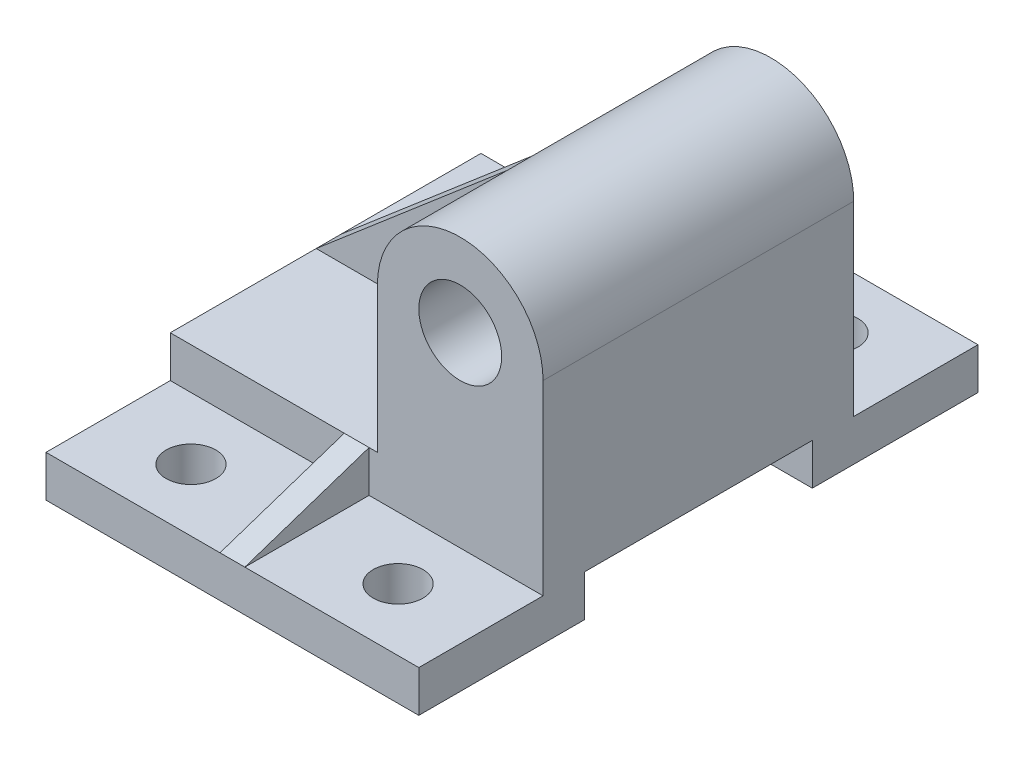
ISO-10303-21;
HEADER;
FILE_DESCRIPTION(('STEP AP214'),'2;1');
FILE_NAME('part.step','',(''),(''),'','','');
FILE_SCHEMA(('AUTOMOTIVE_DESIGN { 1 0 10303 214 1 1 1 1 }'));
ENDSEC;
DATA;
#1=APPLICATION_CONTEXT('core data for automotive mechanical design processes');
#2=APPLICATION_PROTOCOL_DEFINITION('international standard','automotive_design',2000,#1);
#3=PRODUCT_CONTEXT('',#1,'mechanical');
#4=PRODUCT('Part','Part','',(#3));
#5=PRODUCT_RELATED_PRODUCT_CATEGORY('part','',(#4));
#6=PRODUCT_DEFINITION_FORMATION('','',#4);
#7=PRODUCT_DEFINITION_CONTEXT('part definition',#1,'design');
#8=PRODUCT_DEFINITION('design','',#6,#7);
#9=PRODUCT_DEFINITION_SHAPE('','',#8);
#10=(LENGTH_UNIT() NAMED_UNIT(*) SI_UNIT(.MILLI.,.METRE.));
#11=(NAMED_UNIT(*) PLANE_ANGLE_UNIT() SI_UNIT($,.RADIAN.));
#12=(NAMED_UNIT(*) SI_UNIT($,.STERADIAN.) SOLID_ANGLE_UNIT());
#13=UNCERTAINTY_MEASURE_WITH_UNIT(LENGTH_MEASURE(1.E-05),#10,'distance_accuracy_value','');
#14=(GEOMETRIC_REPRESENTATION_CONTEXT(3) GLOBAL_UNCERTAINTY_ASSIGNED_CONTEXT((#13)) GLOBAL_UNIT_ASSIGNED_CONTEXT((#10,
#11,#12)) REPRESENTATION_CONTEXT('',''));
#15=CARTESIAN_POINT('',(0.,0.,0.));
#16=DIRECTION('',(0.,0.,1.));
#17=DIRECTION('',(1.,0.,0.));
#18=AXIS2_PLACEMENT_3D('',#15,#16,#17);
#19=CARTESIAN_POINT('',(-22.5,-17.5,135.));
#20=DIRECTION('',(1.,0.,0.));
#21=DIRECTION('',(0.,1.,0.));
#22=AXIS2_PLACEMENT_3D('',#19,#20,#21);
#23=PLANE('',#22);
#24=DIRECTION('',(0.,0.,-1.));
#25=VECTOR('',#24,1.);
#26=CARTESIAN_POINT('',(-22.5,-17.5,135.));
#27=LINE('',#26,#25);
#28=CARTESIAN_POINT('',(-22.5,-17.5,69.7772488596585));
#29=VERTEX_POINT('',#28);
#30=CARTESIAN_POINT('',(-22.5,-17.5,63.7772488596585));
#31=VERTEX_POINT('',#30);
#32=EDGE_CURVE('E199',#29,#31,#27,.T.);
#33=ORIENTED_EDGE('',*,*,#32,.T.);
#34=DIRECTION('',(0.,0.,-1.));
#35=VECTOR('',#34,1.);
#36=CARTESIAN_POINT('',(-22.5,-17.5,135.));
#37=LINE('',#36,#35);
#38=CARTESIAN_POINT('',(-22.5,-17.5,30.));
#39=VERTEX_POINT('',#38);
#40=EDGE_CURVE('E233',#31,#39,#37,.T.);
#41=ORIENTED_EDGE('',*,*,#40,.T.);
#42=DIRECTION('',(0.,1.,0.));
#43=VECTOR('',#42,1.);
#44=CARTESIAN_POINT('',(-22.5,-27.5,30.));
#45=LINE('',#44,#43);
#46=CARTESIAN_POINT('',(-22.5,-27.5,30.));
#47=VERTEX_POINT('',#46);
#48=EDGE_CURVE('E291',#47,#39,#45,.T.);
#49=ORIENTED_EDGE('',*,*,#48,.F.);
#50=DIRECTION('',(0.,0.,-1.));
#51=VECTOR('',#50,1.);
#52=CARTESIAN_POINT('',(-22.5,-27.5,30.));
#53=LINE('',#52,#51);
#54=CARTESIAN_POINT('',(-22.5,-27.5,0.));
#55=VERTEX_POINT('',#54);
#56=EDGE_CURVE('E308',#47,#55,#53,.T.);
#57=ORIENTED_EDGE('',*,*,#56,.T.);
#58=DIRECTION('',(0.,-1.,0.));
#59=VECTOR('',#58,1.);
#60=CARTESIAN_POINT('',(-22.5,-17.5,0.));
#61=LINE('',#60,#59);
#62=CARTESIAN_POINT('',(-22.5,-37.5,0.));
#63=VERTEX_POINT('',#62);
#64=EDGE_CURVE('E326',#55,#63,#61,.T.);
#65=ORIENTED_EDGE('',*,*,#64,.T.);
#66=DIRECTION('',(0.,0.,-1.));
#67=VECTOR('',#66,1.);
#68=CARTESIAN_POINT('',(-22.5,-37.5,135.));
#69=LINE('',#68,#67);
#70=CARTESIAN_POINT('',(-22.5,-37.5,40.));
#71=VERTEX_POINT('',#70);
#72=EDGE_CURVE('E252',#71,#63,#69,.T.);
#73=ORIENTED_EDGE('',*,*,#72,.F.);
#74=DIRECTION('',(0.,-1.,0.));
#75=VECTOR('',#74,1.);
#76=CARTESIAN_POINT('',(-22.5,-47.5,40.));
#77=LINE('',#76,#75);
#78=CARTESIAN_POINT('',(-22.5,-27.5,40.));
#79=VERTEX_POINT('',#78);
#80=EDGE_CURVE('E411',#79,#71,#77,.T.);
#81=ORIENTED_EDGE('',*,*,#80,.F.);
#82=DIRECTION('',(0.,0.,-1.));
#83=VECTOR('',#82,1.);
#84=CARTESIAN_POINT('',(-22.5,-27.5,40.));
#85=LINE('',#84,#83);
#86=CARTESIAN_POINT('',(-22.5,-27.5,95.));
#87=VERTEX_POINT('',#86);
#88=EDGE_CURVE('E418',#87,#79,#85,.T.);
#89=ORIENTED_EDGE('',*,*,#88,.F.);
#90=DIRECTION('',(0.,1.,0.));
#91=VECTOR('',#90,1.);
#92=CARTESIAN_POINT('',(-22.5,-47.5,95.));
#93=LINE('',#92,#91);
#94=CARTESIAN_POINT('',(-22.5,-37.5,95.));
#95=VERTEX_POINT('',#94);
#96=EDGE_CURVE('E398',#95,#87,#93,.T.);
#97=ORIENTED_EDGE('',*,*,#96,.F.);
#98=CARTESIAN_POINT('',(-22.5,-37.5,135.));
#99=VERTEX_POINT('',#98);
#100=EDGE_CURVE('E253',#99,#95,#69,.T.);
#101=ORIENTED_EDGE('',*,*,#100,.F.);
#102=DIRECTION('',(0.,-1.,0.));
#103=VECTOR('',#102,1.);
#104=CARTESIAN_POINT('',(-22.5,-17.5,135.));
#105=LINE('',#104,#103);
#106=CARTESIAN_POINT('',(-22.5,-27.5,135.));
#107=VERTEX_POINT('',#106);
#108=EDGE_CURVE('E328',#107,#99,#105,.T.);
#109=ORIENTED_EDGE('',*,*,#108,.F.);
#110=DIRECTION('',(0.,0.,1.));
#111=VECTOR('',#110,1.);
#112=CARTESIAN_POINT('',(-22.5,-27.5,105.));
#113=LINE('',#112,#111);
#114=CARTESIAN_POINT('',(-22.5,-27.5,105.));
#115=VERTEX_POINT('',#114);
#116=EDGE_CURVE('E320',#115,#107,#113,.T.);
#117=ORIENTED_EDGE('',*,*,#116,.F.);
#118=DIRECTION('',(0.,-1.,0.));
#119=VECTOR('',#118,1.);
#120=CARTESIAN_POINT('',(-22.5,0.,105.));
#121=LINE('',#120,#119);
#122=CARTESIAN_POINT('',(-22.5,-17.5,105.));
#123=VERTEX_POINT('',#122);
#124=EDGE_CURVE('E231',#123,#115,#121,.T.);
#125=ORIENTED_EDGE('',*,*,#124,.F.);
#126=EDGE_CURVE('E223',#123,#29,#37,.T.);
#127=ORIENTED_EDGE('',*,*,#126,.T.);
#128=EDGE_LOOP('',(#33,#41,#49,#57,#65,#73,#81,#89,#97,#101,#109,#117,#125,#127));
#129=FACE_BOUND('',#128,.T.);
#130=ADVANCED_FACE('F37',(#129),#23,.F.);
#131=CARTESIAN_POINT('',(37.5,27.5,69.7772488596585));
#132=DIRECTION('',(0.,0.,1.));
#133=DIRECTION('',(1.,0.,0.));
#134=AXIS2_PLACEMENT_3D('',#131,#132,#133);
#135=PLANE('',#134);
#136=CARTESIAN_POINT('',(47.5,17.5,69.7772488596585));
#137=DIRECTION('',(0.,0.,1.));
#138=DIRECTION('',(1.,0.,0.));
#139=AXIS2_PLACEMENT_3D('',#136,#137,#138);
#140=CIRCLE('',#139,20.);
#141=CARTESIAN_POINT('',(30.1794919243112,27.5,69.7772488596585));
#142=VERTEX_POINT('',#141);
#143=CARTESIAN_POINT('',(27.5,17.5,69.7772488596585));
#144=VERTEX_POINT('',#143);
#145=EDGE_CURVE('E214',#142,#144,#140,.T.);
#146=ORIENTED_EDGE('',*,*,#145,.F.);
#147=DIRECTION('',(-0.760352764253766,-0.649510333937542,0.));
#148=VECTOR('',#147,1.);
#149=CARTESIAN_POINT('',(34.4117435684364,31.1152839943724,69.7772488596585));
#150=LINE('',#149,#148);
#151=EDGE_CURVE('E202',#142,#29,#150,.T.);
#152=ORIENTED_EDGE('',*,*,#151,.T.);
#153=DIRECTION('',(-1.,0.,0.));
#154=VECTOR('',#153,1.);
#155=CARTESIAN_POINT('',(37.5,-17.5,69.7772488596585));
#156=LINE('',#155,#154);
#157=CARTESIAN_POINT('',(27.5,-17.5,69.7772488596585));
#158=VERTEX_POINT('',#157);
#159=EDGE_CURVE('E211',#158,#29,#156,.T.);
#160=ORIENTED_EDGE('',*,*,#159,.F.);
#161=DIRECTION('',(0.,-1.,0.));
#162=VECTOR('',#161,1.);
#163=CARTESIAN_POINT('',(27.5,17.5,69.7772488596585));
#164=LINE('',#163,#162);
#165=EDGE_CURVE('E453',#144,#158,#164,.T.);
#166=ORIENTED_EDGE('',*,*,#165,.F.);
#167=EDGE_LOOP('',(#146,#152,#160,#166));
#168=FACE_BOUND('',#167,.T.);
#169=ADVANCED_FACE('F210',(#168),#135,.T.);
#170=CARTESIAN_POINT('',(37.5,27.5,63.7772488596585));
#171=DIRECTION('',(0.,0.,-1.));
#172=DIRECTION('',(-1.,0.,0.));
#173=AXIS2_PLACEMENT_3D('',#170,#171,#172);
#174=PLANE('',#173);
#175=DIRECTION('',(-1.,0.,0.));
#176=VECTOR('',#175,1.);
#177=CARTESIAN_POINT('',(37.5,-17.5,63.7772488596585));
#178=LINE('',#177,#176);
#179=CARTESIAN_POINT('',(27.5,-17.5,63.7772488596585));
#180=VERTEX_POINT('',#179);
#181=EDGE_CURVE('E216',#180,#31,#178,.T.);
#182=ORIENTED_EDGE('',*,*,#181,.T.);
#183=DIRECTION('',(0.760352764253766,0.649510333937542,0.));
#184=VECTOR('',#183,1.);
#185=CARTESIAN_POINT('',(34.4117435684364,31.1152839943724,63.7772488596585));
#186=LINE('',#185,#184);
#187=CARTESIAN_POINT('',(30.1794919243112,27.5,63.7772488596585));
#188=VERTEX_POINT('',#187);
#189=EDGE_CURVE('E11',#31,#188,#186,.T.);
#190=ORIENTED_EDGE('',*,*,#189,.T.);
#191=CARTESIAN_POINT('',(47.5,17.5,63.7772488596585));
#192=DIRECTION('',(0.,0.,-1.));
#193=DIRECTION('',(-1.,0.,0.));
#194=AXIS2_PLACEMENT_3D('',#191,#192,#193);
#195=CIRCLE('',#194,20.);
#196=CARTESIAN_POINT('',(27.5,17.5,63.7772488596585));
#197=VERTEX_POINT('',#196);
#198=EDGE_CURVE('E275',#197,#188,#195,.T.);
#199=ORIENTED_EDGE('',*,*,#198,.F.);
#200=DIRECTION('',(0.,1.,0.));
#201=VECTOR('',#200,1.);
#202=CARTESIAN_POINT('',(27.5,17.5,63.7772488596585));
#203=LINE('',#202,#201);
#204=EDGE_CURVE('E227',#180,#197,#203,.T.);
#205=ORIENTED_EDGE('',*,*,#204,.F.);
#206=EDGE_LOOP('',(#182,#190,#199,#205));
#207=FACE_BOUND('',#206,.T.);
#208=ADVANCED_FACE('F277',(#207),#174,.T.);
#209=CARTESIAN_POINT('',(27.5,-17.5,135.));
#210=DIRECTION('',(0.,-1.,0.));
#211=DIRECTION('',(1.,0.,0.));
#212=AXIS2_PLACEMENT_3D('',#209,#210,#211);
#213=PLANE('',#212);
#214=DIRECTION('',(0.,0.,-1.));
#215=VECTOR('',#214,1.);
#216=CARTESIAN_POINT('',(27.5,-17.5,135.));
#217=LINE('',#216,#215);
#218=CARTESIAN_POINT('',(27.5,-17.5,105.));
#219=VERTEX_POINT('',#218);
#220=EDGE_CURVE('E226',#219,#158,#217,.T.);
#221=ORIENTED_EDGE('',*,*,#220,.T.);
#222=ORIENTED_EDGE('',*,*,#159,.T.);
#223=ORIENTED_EDGE('',*,*,#126,.F.);
#224=DIRECTION('',(-1.,0.,0.));
#225=VECTOR('',#224,1.);
#226=CARTESIAN_POINT('',(27.5,-17.5,105.));
#227=LINE('',#226,#225);
#228=CARTESIAN_POINT('',(19.5,-17.5,105.));
#229=VERTEX_POINT('',#228);
#230=EDGE_CURVE('E256',#229,#123,#227,.T.);
#231=ORIENTED_EDGE('',*,*,#230,.F.);
#232=DIRECTION('',(-1.,0.,0.));
#233=VECTOR('',#232,1.);
#234=CARTESIAN_POINT('',(67.5,-17.5,105.));
#235=LINE('',#234,#233);
#236=CARTESIAN_POINT('',(25.5,-17.5,105.));
#237=VERTEX_POINT('',#236);
#238=EDGE_CURVE('E464',#237,#229,#235,.T.);
#239=ORIENTED_EDGE('',*,*,#238,.F.);
#240=EDGE_CURVE('E257',#219,#237,#227,.T.);
#241=ORIENTED_EDGE('',*,*,#240,.F.);
#242=EDGE_LOOP('',(#221,#222,#223,#231,#239,#241));
#243=FACE_BOUND('',#242,.T.);
#244=ADVANCED_FACE('F221',(#243),#213,.F.);
#245=CARTESIAN_POINT('',(27.5,17.5,135.));
#246=DIRECTION('',(1.,0.,0.));
#247=DIRECTION('',(0.,1.,0.));
#248=AXIS2_PLACEMENT_3D('',#245,#246,#247);
#249=PLANE('',#248);
#250=DIRECTION('',(0.,0.,-1.));
#251=VECTOR('',#250,1.);
#252=CARTESIAN_POINT('',(27.5,17.5,135.));
#253=LINE('',#252,#251);
#254=CARTESIAN_POINT('',(27.5,17.4999999999999,105.));
#255=VERTEX_POINT('',#254);
#256=EDGE_CURVE('E242',#255,#144,#253,.T.);
#257=ORIENTED_EDGE('',*,*,#256,.T.);
#258=ORIENTED_EDGE('',*,*,#165,.T.);
#259=ORIENTED_EDGE('',*,*,#220,.F.);
#260=DIRECTION('',(0.,-1.,0.));
#261=VECTOR('',#260,1.);
#262=CARTESIAN_POINT('',(27.5,-17.5,105.));
#263=LINE('',#262,#261);
#264=EDGE_CURVE('E424',#255,#219,#263,.T.);
#265=ORIENTED_EDGE('',*,*,#264,.F.);
#266=EDGE_LOOP('',(#257,#258,#259,#265));
#267=FACE_BOUND('',#266,.T.);
#268=ADVANCED_FACE('F452',(#267),#249,.F.);
#269=ORIENTED_EDGE('',*,*,#40,.F.);
#270=ORIENTED_EDGE('',*,*,#181,.F.);
#271=CARTESIAN_POINT('',(27.5,-17.5,30.));
#272=VERTEX_POINT('',#271);
#273=EDGE_CURVE('E232',#180,#272,#217,.T.);
#274=ORIENTED_EDGE('',*,*,#273,.T.);
#275=DIRECTION('',(1.,0.,0.));
#276=VECTOR('',#275,1.);
#277=CARTESIAN_POINT('',(-22.5,-17.5,30.));
#278=LINE('',#277,#276);
#279=CARTESIAN_POINT('',(25.5,-17.5,30.));
#280=VERTEX_POINT('',#279);
#281=EDGE_CURVE('E295',#280,#272,#278,.T.);
#282=ORIENTED_EDGE('',*,*,#281,.F.);
#283=DIRECTION('',(-1.,0.,0.));
#284=VECTOR('',#283,1.);
#285=CARTESIAN_POINT('',(67.5,-17.5,30.));
#286=LINE('',#285,#284);
#287=CARTESIAN_POINT('',(19.5,-17.5,30.));
#288=VERTEX_POINT('',#287);
#289=EDGE_CURVE('E455',#280,#288,#286,.T.);
#290=ORIENTED_EDGE('',*,*,#289,.T.);
#291=EDGE_CURVE('E287',#39,#288,#278,.T.);
#292=ORIENTED_EDGE('',*,*,#291,.F.);
#293=EDGE_LOOP('',(#269,#270,#274,#282,#290,#292));
#294=FACE_BOUND('',#293,.T.);
#295=ADVANCED_FACE('F285',(#294),#213,.F.);
#296=CARTESIAN_POINT('',(47.5,17.5,0.));
#297=DIRECTION('',(0.,0.,1.));
#298=DIRECTION('',(1.,0.,0.));
#299=AXIS2_PLACEMENT_3D('',#296,#297,#298);
#300=PLANE('',#299);
#301=DIRECTION('',(-1.,0.,0.));
#302=VECTOR('',#301,1.);
#303=CARTESIAN_POINT('',(67.5,-27.5,0.));
#304=LINE('',#303,#302);
#305=CARTESIAN_POINT('',(25.5,-27.5,0.));
#306=VERTEX_POINT('',#305);
#307=CARTESIAN_POINT('',(19.5,-27.5,0.));
#308=VERTEX_POINT('',#307);
#309=EDGE_CURVE('E353',#306,#308,#304,.T.);
#310=ORIENTED_EDGE('',*,*,#309,.F.);
#311=DIRECTION('',(-1.,0.,0.));
#312=VECTOR('',#311,1.);
#313=CARTESIAN_POINT('',(-22.5,-27.5,0.));
#314=LINE('',#313,#312);
#315=CARTESIAN_POINT('',(67.5,-27.5,0.));
#316=VERTEX_POINT('',#315);
#317=EDGE_CURVE('E304',#316,#306,#314,.T.);
#318=ORIENTED_EDGE('',*,*,#317,.F.);
#319=DIRECTION('',(0.,1.,0.));
#320=VECTOR('',#319,1.);
#321=CARTESIAN_POINT('',(67.5,17.5,0.));
#322=LINE('',#321,#320);
#323=CARTESIAN_POINT('',(67.5,-37.5,0.));
#324=VERTEX_POINT('',#323);
#325=EDGE_CURVE('E238',#324,#316,#322,.T.);
#326=ORIENTED_EDGE('',*,*,#325,.F.);
#327=DIRECTION('',(1.,0.,0.));
#328=VECTOR('',#327,1.);
#329=CARTESIAN_POINT('',(67.5,-37.5,0.));
#330=LINE('',#329,#328);
#331=EDGE_CURVE('E335',#63,#324,#330,.T.);
#332=ORIENTED_EDGE('',*,*,#331,.F.);
#333=ORIENTED_EDGE('',*,*,#64,.F.);
#334=EDGE_CURVE('E307',#308,#55,#314,.T.);
#335=ORIENTED_EDGE('',*,*,#334,.F.);
#336=EDGE_LOOP('',(#310,#318,#326,#332,#333,#335));
#337=FACE_BOUND('',#336,.T.);
#338=ADVANCED_FACE('F350',(#337),#300,.F.);
#339=CARTESIAN_POINT('',(19.5,-17.5,0.));
#340=DIRECTION('',(1.,0.,0.));
#341=DIRECTION('',(0.,1.,0.));
#342=AXIS2_PLACEMENT_3D('',#339,#340,#341);
#343=PLANE('',#342);
#344=DIRECTION('',(0.,0.316227766016838,0.948683298050514));
#345=VECTOR('',#344,1.);
#346=CARTESIAN_POINT('',(19.5,-26.5,3.));
#347=LINE('',#346,#345);
#348=EDGE_CURVE('E461',#308,#288,#347,.T.);
#349=ORIENTED_EDGE('',*,*,#348,.F.);
#350=DIRECTION('',(0.,0.,1.));
#351=VECTOR('',#350,1.);
#352=CARTESIAN_POINT('',(19.5,-27.5,0.));
#353=LINE('',#352,#351);
#354=CARTESIAN_POINT('',(19.5,-27.5,30.));
#355=VERTEX_POINT('',#354);
#356=EDGE_CURVE('E362',#308,#355,#353,.T.);
#357=ORIENTED_EDGE('',*,*,#356,.T.);
#358=DIRECTION('',(0.,-1.,0.));
#359=VECTOR('',#358,1.);
#360=CARTESIAN_POINT('',(19.5,-17.5,30.));
#361=LINE('',#360,#359);
#362=EDGE_CURVE('E51',#288,#355,#361,.T.);
#363=ORIENTED_EDGE('',*,*,#362,.F.);
#364=EDGE_LOOP('',(#349,#357,#363));
#365=FACE_BOUND('',#364,.T.);
#366=ADVANCED_FACE('F507',(#365),#343,.F.);
#367=CARTESIAN_POINT('',(25.5,-17.5,0.));
#368=DIRECTION('',(-1.,0.,0.));
#369=DIRECTION('',(0.,-1.,0.));
#370=AXIS2_PLACEMENT_3D('',#367,#368,#369);
#371=PLANE('',#370);
#372=DIRECTION('',(0.,-0.316227766016838,-0.948683298050514));
#373=VECTOR('',#372,1.);
#374=CARTESIAN_POINT('',(25.5,-26.5,3.));
#375=LINE('',#374,#373);
#376=EDGE_CURVE('E269',#280,#306,#375,.T.);
#377=ORIENTED_EDGE('',*,*,#376,.F.);
#378=DIRECTION('',(0.,-1.,0.));
#379=VECTOR('',#378,1.);
#380=CARTESIAN_POINT('',(25.5,-17.5,30.));
#381=LINE('',#380,#379);
#382=CARTESIAN_POINT('',(25.5,-27.5,30.));
#383=VERTEX_POINT('',#382);
#384=EDGE_CURVE('E361',#280,#383,#381,.T.);
#385=ORIENTED_EDGE('',*,*,#384,.T.);
#386=DIRECTION('',(0.,0.,-1.));
#387=VECTOR('',#386,1.);
#388=CARTESIAN_POINT('',(25.5,-27.5,0.));
#389=LINE('',#388,#387);
#390=EDGE_CURVE('E59',#383,#306,#389,.T.);
#391=ORIENTED_EDGE('',*,*,#390,.T.);
#392=EDGE_LOOP('',(#377,#385,#391));
#393=FACE_BOUND('',#392,.T.);
#394=ADVANCED_FACE('F358',(#393),#371,.F.);
#395=CARTESIAN_POINT('',(-22.5,-27.5,30.));
#396=DIRECTION('',(0.,-1.,0.));
#397=DIRECTION('',(1.,0.,0.));
#398=AXIS2_PLACEMENT_3D('',#395,#396,#397);
#399=PLANE('',#398);
#400=CARTESIAN_POINT('',(-2.49999999999998,-27.5,15.));
#401=DIRECTION('',(0.,1.,0.));
#402=DIRECTION('',(-1.,0.,0.));
#403=AXIS2_PLACEMENT_3D('',#400,#401,#402);
#404=CIRCLE('',#403,6.);
#405=CARTESIAN_POINT('',(-8.49999999999998,-27.5,15.));
#406=VERTEX_POINT('',#405);
#407=EDGE_CURVE('E390',#406,#406,#404,.T.);
#408=ORIENTED_EDGE('',*,*,#407,.F.);
#409=EDGE_LOOP('',(#408));
#410=FACE_BOUND('',#409,.T.);
#411=ORIENTED_EDGE('',*,*,#356,.F.);
#412=ORIENTED_EDGE('',*,*,#334,.T.);
#413=ORIENTED_EDGE('',*,*,#56,.F.);
#414=DIRECTION('',(-1.,0.,0.));
#415=VECTOR('',#414,1.);
#416=CARTESIAN_POINT('',(-22.5,-27.5,30.));
#417=LINE('',#416,#415);
#418=EDGE_CURVE('E293',#355,#47,#417,.T.);
#419=ORIENTED_EDGE('',*,*,#418,.F.);
#420=EDGE_LOOP('',(#411,#412,#413,#419));
#421=FACE_BOUND('',#420,.T.);
#422=ADVANCED_FACE('F504',(#410,#421),#399,.F.);
#423=CARTESIAN_POINT('',(47.5,-27.5,15.));
#424=DIRECTION('',(0.,1.,0.));
#425=DIRECTION('',(-1.,0.,0.));
#426=AXIS2_PLACEMENT_3D('',#423,#424,#425);
#427=CIRCLE('',#426,6.);
#428=CARTESIAN_POINT('',(41.5,-27.5,15.));
#429=VERTEX_POINT('',#428);
#430=EDGE_CURVE('E387',#429,#429,#427,.T.);
#431=ORIENTED_EDGE('',*,*,#430,.F.);
#432=EDGE_LOOP('',(#431));
#433=FACE_BOUND('',#432,.T.);
#434=ORIENTED_EDGE('',*,*,#390,.F.);
#435=CARTESIAN_POINT('',(67.5,-27.5,30.));
#436=VERTEX_POINT('',#435);
#437=EDGE_CURVE('E296',#436,#383,#417,.T.);
#438=ORIENTED_EDGE('',*,*,#437,.F.);
#439=DIRECTION('',(0.,0.,-1.));
#440=VECTOR('',#439,1.);
#441=CARTESIAN_POINT('',(67.5,-27.5,30.));
#442=LINE('',#441,#440);
#443=EDGE_CURVE('E303',#436,#316,#442,.T.);
#444=ORIENTED_EDGE('',*,*,#443,.T.);
#445=ORIENTED_EDGE('',*,*,#317,.T.);
#446=EDGE_LOOP('',(#434,#438,#444,#445));
#447=FACE_BOUND('',#446,.T.);
#448=ADVANCED_FACE('F354',(#433,#447),#399,.F.);
#449=CARTESIAN_POINT('',(0.,0.,30.));
#450=DIRECTION('',(0.,0.,-1.));
#451=DIRECTION('',(-1.,0.,0.));
#452=AXIS2_PLACEMENT_3D('',#449,#450,#451);
#453=PLANE('',#452);
#454=ORIENTED_EDGE('',*,*,#291,.T.);
#455=ORIENTED_EDGE('',*,*,#362,.T.);
#456=ORIENTED_EDGE('',*,*,#418,.T.);
#457=ORIENTED_EDGE('',*,*,#48,.T.);
#458=EDGE_LOOP('',(#454,#455,#456,#457));
#459=FACE_BOUND('',#458,.T.);
#460=ADVANCED_FACE('F292',(#459),#453,.T.);
#461=DIRECTION('',(0.,-1.,0.));
#462=VECTOR('',#461,1.);
#463=CARTESIAN_POINT('',(67.5,-27.5,30.));
#464=LINE('',#463,#462);
#465=CARTESIAN_POINT('',(67.5,17.4999999999999,30.));
#466=VERTEX_POINT('',#465);
#467=EDGE_CURVE('E306',#466,#436,#464,.T.);
#468=ORIENTED_EDGE('',*,*,#467,.T.);
#469=ORIENTED_EDGE('',*,*,#437,.T.);
#470=ORIENTED_EDGE('',*,*,#384,.F.);
#471=ORIENTED_EDGE('',*,*,#281,.T.);
#472=DIRECTION('',(0.,1.,0.));
#473=VECTOR('',#472,1.);
#474=CARTESIAN_POINT('',(27.5,-17.5,30.));
#475=LINE('',#474,#473);
#476=CARTESIAN_POINT('',(27.5,17.5,30.));
#477=VERTEX_POINT('',#476);
#478=EDGE_CURVE('E433',#272,#477,#475,.T.);
#479=ORIENTED_EDGE('',*,*,#478,.T.);
#480=CARTESIAN_POINT('',(47.5,17.5,30.));
#481=DIRECTION('',(0.,0.,-1.));
#482=DIRECTION('',(-1.,0.,0.));
#483=AXIS2_PLACEMENT_3D('',#480,#481,#482);
#484=CIRCLE('',#483,20.);
#485=EDGE_CURVE('E436',#477,#466,#484,.T.);
#486=ORIENTED_EDGE('',*,*,#485,.T.);
#487=EDGE_LOOP('',(#468,#469,#470,#471,#479,#486));
#488=FACE_BOUND('',#487,.T.);
#489=CARTESIAN_POINT('',(47.5,17.5,30.));
#490=DIRECTION('',(0.,0.,-1.));
#491=DIRECTION('',(-1.,0.,0.));
#492=AXIS2_PLACEMENT_3D('',#489,#490,#491);
#493=CIRCLE('',#492,10.);
#494=CARTESIAN_POINT('',(37.5,17.5,30.));
#495=VERTEX_POINT('',#494);
#496=EDGE_CURVE('E438',#495,#495,#493,.T.);
#497=ORIENTED_EDGE('',*,*,#496,.F.);
#498=EDGE_LOOP('',(#497));
#499=FACE_BOUND('',#498,.T.);
#500=ADVANCED_FACE('F441',(#488,#499),#453,.T.);
#501=CARTESIAN_POINT('',(0.,-27.5,105.));
#502=DIRECTION('',(0.,-1.,0.));
#503=DIRECTION('',(0.,0.,-1.));
#504=AXIS2_PLACEMENT_3D('',#501,#502,#503);
#505=PLANE('',#504);
#506=CARTESIAN_POINT('',(47.5,-27.5,120.));
#507=DIRECTION('',(0.,1.,0.));
#508=DIRECTION('',(0.,0.,1.));
#509=AXIS2_PLACEMENT_3D('',#506,#507,#508);
#510=CIRCLE('',#509,6.00000000000001);
#511=CARTESIAN_POINT('',(47.5,-27.5,126.));
#512=VERTEX_POINT('',#511);
#513=EDGE_CURVE('E402',#512,#512,#510,.T.);
#514=ORIENTED_EDGE('',*,*,#513,.F.);
#515=EDGE_LOOP('',(#514));
#516=FACE_BOUND('',#515,.T.);
#517=DIRECTION('',(0.,0.,-1.));
#518=VECTOR('',#517,1.);
#519=CARTESIAN_POINT('',(25.5,-27.5,105.));
#520=LINE('',#519,#518);
#521=CARTESIAN_POINT('',(25.5,-27.5,135.));
#522=VERTEX_POINT('',#521);
#523=CARTESIAN_POINT('',(25.5,-27.5,105.));
#524=VERTEX_POINT('',#523);
#525=EDGE_CURVE('E371',#522,#524,#520,.T.);
#526=ORIENTED_EDGE('',*,*,#525,.F.);
#527=DIRECTION('',(1.,0.,0.));
#528=VECTOR('',#527,1.);
#529=CARTESIAN_POINT('',(0.,-27.5,135.));
#530=LINE('',#529,#528);
#531=CARTESIAN_POINT('',(67.5,-27.5,135.));
#532=VERTEX_POINT('',#531);
#533=EDGE_CURVE('E310',#522,#532,#530,.T.);
#534=ORIENTED_EDGE('',*,*,#533,.T.);
#535=DIRECTION('',(0.,0.,1.));
#536=VECTOR('',#535,1.);
#537=CARTESIAN_POINT('',(67.5,-27.5,105.));
#538=LINE('',#537,#536);
#539=CARTESIAN_POINT('',(67.5,-27.5,105.));
#540=VERTEX_POINT('',#539);
#541=EDGE_CURVE('E323',#540,#532,#538,.T.);
#542=ORIENTED_EDGE('',*,*,#541,.F.);
#543=DIRECTION('',(1.,0.,0.));
#544=VECTOR('',#543,1.);
#545=CARTESIAN_POINT('',(0.,-27.5,105.));
#546=LINE('',#545,#544);
#547=EDGE_CURVE('E316',#524,#540,#546,.T.);
#548=ORIENTED_EDGE('',*,*,#547,.F.);
#549=EDGE_LOOP('',(#526,#534,#542,#548));
#550=FACE_BOUND('',#549,.T.);
#551=ADVANCED_FACE('F478',(#516,#550),#505,.F.);
#552=CARTESIAN_POINT('',(-2.49999999999998,-27.5,120.));
#553=DIRECTION('',(0.,1.,0.));
#554=DIRECTION('',(0.,0.,1.));
#555=AXIS2_PLACEMENT_3D('',#552,#553,#554);
#556=CIRCLE('',#555,6.);
#557=CARTESIAN_POINT('',(-2.49999999999998,-27.5,126.));
#558=VERTEX_POINT('',#557);
#559=EDGE_CURVE('E399',#558,#558,#556,.T.);
#560=ORIENTED_EDGE('',*,*,#559,.F.);
#561=EDGE_LOOP('',(#560));
#562=FACE_BOUND('',#561,.T.);
#563=DIRECTION('',(0.,0.,1.));
#564=VECTOR('',#563,1.);
#565=CARTESIAN_POINT('',(19.5,-27.5,105.));
#566=LINE('',#565,#564);
#567=CARTESIAN_POINT('',(19.5,-27.5,105.));
#568=VERTEX_POINT('',#567);
#569=CARTESIAN_POINT('',(19.5,-27.5,135.));
#570=VERTEX_POINT('',#569);
#571=EDGE_CURVE('E374',#568,#570,#566,.T.);
#572=ORIENTED_EDGE('',*,*,#571,.F.);
#573=EDGE_CURVE('E317',#115,#568,#546,.T.);
#574=ORIENTED_EDGE('',*,*,#573,.F.);
#575=ORIENTED_EDGE('',*,*,#116,.T.);
#576=EDGE_CURVE('E314',#107,#570,#530,.T.);
#577=ORIENTED_EDGE('',*,*,#576,.T.);
#578=EDGE_LOOP('',(#572,#574,#575,#577));
#579=FACE_BOUND('',#578,.T.);
#580=ADVANCED_FACE('F582',(#562,#579),#505,.F.);
#581=CARTESIAN_POINT('',(0.,0.,105.));
#582=DIRECTION('',(0.,0.,1.));
#583=DIRECTION('',(1.,0.,0.));
#584=AXIS2_PLACEMENT_3D('',#581,#582,#583);
#585=PLANE('',#584);
#586=DIRECTION('',(0.,1.,0.));
#587=VECTOR('',#586,1.);
#588=CARTESIAN_POINT('',(67.5,0.,105.));
#589=LINE('',#588,#587);
#590=CARTESIAN_POINT('',(67.5,17.5,105.));
#591=VERTEX_POINT('',#590);
#592=EDGE_CURVE('E312',#540,#591,#589,.T.);
#593=ORIENTED_EDGE('',*,*,#592,.T.);
#594=CARTESIAN_POINT('',(47.5,17.5,105.));
#595=DIRECTION('',(0.,0.,1.));
#596=DIRECTION('',(1.,0.,0.));
#597=AXIS2_PLACEMENT_3D('',#594,#595,#596);
#598=CIRCLE('',#597,20.);
#599=EDGE_CURVE('E428',#591,#255,#598,.T.);
#600=ORIENTED_EDGE('',*,*,#599,.T.);
#601=ORIENTED_EDGE('',*,*,#264,.T.);
#602=ORIENTED_EDGE('',*,*,#240,.T.);
#603=DIRECTION('',(0.,-1.,0.));
#604=VECTOR('',#603,1.);
#605=CARTESIAN_POINT('',(25.5,-17.5,105.));
#606=LINE('',#605,#604);
#607=EDGE_CURVE('E380',#237,#524,#606,.T.);
#608=ORIENTED_EDGE('',*,*,#607,.T.);
#609=ORIENTED_EDGE('',*,*,#547,.T.);
#610=EDGE_LOOP('',(#593,#600,#601,#602,#608,#609));
#611=FACE_BOUND('',#610,.T.);
#612=CARTESIAN_POINT('',(47.5,17.5,105.));
#613=DIRECTION('',(0.,0.,1.));
#614=DIRECTION('',(1.,0.,0.));
#615=AXIS2_PLACEMENT_3D('',#612,#613,#614);
#616=CIRCLE('',#615,10.);
#617=CARTESIAN_POINT('',(57.5,17.5,105.));
#618=VERTEX_POINT('',#617);
#619=EDGE_CURVE('E430',#618,#618,#616,.T.);
#620=ORIENTED_EDGE('',*,*,#619,.F.);
#621=EDGE_LOOP('',(#620));
#622=FACE_BOUND('',#621,.T.);
#623=ADVANCED_FACE('F449',(#611,#622),#585,.T.);
#624=ORIENTED_EDGE('',*,*,#573,.T.);
#625=DIRECTION('',(0.,-1.,0.));
#626=VECTOR('',#625,1.);
#627=CARTESIAN_POINT('',(19.5,-17.5,105.));
#628=LINE('',#627,#626);
#629=EDGE_CURVE('E377',#229,#568,#628,.T.);
#630=ORIENTED_EDGE('',*,*,#629,.F.);
#631=ORIENTED_EDGE('',*,*,#230,.T.);
#632=ORIENTED_EDGE('',*,*,#124,.T.);
#633=EDGE_LOOP('',(#624,#630,#631,#632));
#634=FACE_BOUND('',#633,.T.);
#635=ADVANCED_FACE('F581',(#634),#585,.T.);
#636=CARTESIAN_POINT('',(67.5,-37.5,135.));
#637=DIRECTION('',(0.,1.,0.));
#638=DIRECTION('',(-1.,0.,0.));
#639=AXIS2_PLACEMENT_3D('',#636,#637,#638);
#640=PLANE('',#639);
#641=CARTESIAN_POINT('',(-2.49999999999998,-37.5,120.));
#642=DIRECTION('',(0.,1.,0.));
#643=DIRECTION('',(0.,0.,1.));
#644=AXIS2_PLACEMENT_3D('',#641,#642,#643);
#645=CIRCLE('',#644,6.);
#646=CARTESIAN_POINT('',(-2.49999999999998,-37.5,126.));
#647=VERTEX_POINT('',#646);
#648=EDGE_CURVE('E395',#647,#647,#645,.T.);
#649=ORIENTED_EDGE('',*,*,#648,.T.);
#650=EDGE_LOOP('',(#649));
#651=FACE_BOUND('',#650,.T.);
#652=CARTESIAN_POINT('',(47.5,-37.5,120.));
#653=DIRECTION('',(0.,1.,0.));
#654=DIRECTION('',(0.,0.,1.));
#655=AXIS2_PLACEMENT_3D('',#652,#653,#654);
#656=CIRCLE('',#655,6.00000000000001);
#657=CARTESIAN_POINT('',(47.5,-37.5,126.));
#658=VERTEX_POINT('',#657);
#659=EDGE_CURVE('E386',#658,#658,#656,.T.);
#660=ORIENTED_EDGE('',*,*,#659,.T.);
#661=EDGE_LOOP('',(#660));
#662=FACE_BOUND('',#661,.T.);
#663=ORIENTED_EDGE('',*,*,#100,.T.);
#664=DIRECTION('',(1.,0.,0.));
#665=VECTOR('',#664,1.);
#666=CARTESIAN_POINT('',(67.5,-37.5,95.));
#667=LINE('',#666,#665);
#668=CARTESIAN_POINT('',(67.5,-37.5,95.));
#669=VERTEX_POINT('',#668);
#670=EDGE_CURVE('E263',#95,#669,#667,.T.);
#671=ORIENTED_EDGE('',*,*,#670,.T.);
#672=DIRECTION('',(0.,0.,-1.));
#673=VECTOR('',#672,1.);
#674=CARTESIAN_POINT('',(67.5,-37.5,135.));
#675=LINE('',#674,#673);
#676=CARTESIAN_POINT('',(67.5,-37.5,135.));
#677=VERTEX_POINT('',#676);
#678=EDGE_CURVE('E249',#677,#669,#675,.T.);
#679=ORIENTED_EDGE('',*,*,#678,.F.);
#680=DIRECTION('',(1.,0.,0.));
#681=VECTOR('',#680,1.);
#682=CARTESIAN_POINT('',(67.5,-37.5,135.));
#683=LINE('',#682,#681);
#684=EDGE_CURVE('E330',#99,#677,#683,.T.);
#685=ORIENTED_EDGE('',*,*,#684,.F.);
#686=EDGE_LOOP('',(#663,#671,#679,#685));
#687=FACE_BOUND('',#686,.T.);
#688=ADVANCED_FACE('F487',(#651,#662,#687),#640,.F.);
#689=CARTESIAN_POINT('',(67.5,17.5,135.));
#690=DIRECTION('',(-1.,0.,0.));
#691=DIRECTION('',(0.,-1.,0.));
#692=AXIS2_PLACEMENT_3D('',#689,#690,#691);
#693=PLANE('',#692);
#694=ORIENTED_EDGE('',*,*,#678,.T.);
#695=DIRECTION('',(0.,1.,0.));
#696=VECTOR('',#695,1.);
#697=CARTESIAN_POINT('',(67.5,-47.5,95.));
#698=LINE('',#697,#696);
#699=CARTESIAN_POINT('',(67.5,-27.5,95.));
#700=VERTEX_POINT('',#699);
#701=EDGE_CURVE('E407',#669,#700,#698,.T.);
#702=ORIENTED_EDGE('',*,*,#701,.T.);
#703=DIRECTION('',(0.,0.,-1.));
#704=VECTOR('',#703,1.);
#705=CARTESIAN_POINT('',(67.5,-27.5,40.));
#706=LINE('',#705,#704);
#707=CARTESIAN_POINT('',(67.5,-27.5,40.));
#708=VERTEX_POINT('',#707);
#709=EDGE_CURVE('E410',#700,#708,#706,.T.);
#710=ORIENTED_EDGE('',*,*,#709,.T.);
#711=DIRECTION('',(0.,-1.,0.));
#712=VECTOR('',#711,1.);
#713=CARTESIAN_POINT('',(67.5,-47.5,40.));
#714=LINE('',#713,#712);
#715=CARTESIAN_POINT('',(67.5,-37.5,40.));
#716=VERTEX_POINT('',#715);
#717=EDGE_CURVE('E414',#708,#716,#714,.T.);
#718=ORIENTED_EDGE('',*,*,#717,.T.);
#719=EDGE_CURVE('E248',#716,#324,#675,.T.);
#720=ORIENTED_EDGE('',*,*,#719,.T.);
#721=ORIENTED_EDGE('',*,*,#325,.T.);
#722=ORIENTED_EDGE('',*,*,#443,.F.);
#723=ORIENTED_EDGE('',*,*,#467,.F.);
#724=DIRECTION('',(0.,0.,-1.));
#725=VECTOR('',#724,1.);
#726=CARTESIAN_POINT('',(67.5,17.5,135.));
#727=LINE('',#726,#725);
#728=EDGE_CURVE('E245',#591,#466,#727,.T.);
#729=ORIENTED_EDGE('',*,*,#728,.F.);
#730=ORIENTED_EDGE('',*,*,#592,.F.);
#731=ORIENTED_EDGE('',*,*,#541,.T.);
#732=DIRECTION('',(0.,1.,0.));
#733=VECTOR('',#732,1.);
#734=CARTESIAN_POINT('',(67.5,17.5,135.));
#735=LINE('',#734,#733);
#736=EDGE_CURVE('E236',#677,#532,#735,.T.);
#737=ORIENTED_EDGE('',*,*,#736,.F.);
#738=EDGE_LOOP('',(#694,#702,#710,#718,#720,#721,#722,#723,#729,#730,#731,#737));
#739=FACE_BOUND('',#738,.T.);
#740=ADVANCED_FACE('F344',(#739),#693,.F.);
#741=CARTESIAN_POINT('',(47.5,17.5,135.));
#742=DIRECTION('',(0.,0.,-1.));
#743=DIRECTION('',(-1.,0.,0.));
#744=AXIS2_PLACEMENT_3D('',#741,#742,#743);
#745=CYLINDRICAL_SURFACE('',#744,20.);
#746=ORIENTED_EDGE('',*,*,#728,.T.);
#747=ORIENTED_EDGE('',*,*,#485,.F.);
#748=EDGE_CURVE('E241',#197,#477,#253,.T.);
#749=ORIENTED_EDGE('',*,*,#748,.F.);
#750=ORIENTED_EDGE('',*,*,#198,.T.);
#751=DIRECTION('',(0.,0.,-1.));
#752=VECTOR('',#751,1.);
#753=CARTESIAN_POINT('',(30.1794919243112,27.5,135.));
#754=LINE('',#753,#752);
#755=EDGE_CURVE('E44',#188,#142,#754,.F.);
#756=ORIENTED_EDGE('',*,*,#755,.T.);
#757=ORIENTED_EDGE('',*,*,#145,.T.);
#758=ORIENTED_EDGE('',*,*,#256,.F.);
#759=ORIENTED_EDGE('',*,*,#599,.F.);
#760=EDGE_LOOP('',(#746,#747,#749,#750,#756,#757,#758,#759));
#761=FACE_BOUND('',#760,.T.);
#762=ADVANCED_FACE('F272',(#761),#745,.T.);
#763=ORIENTED_EDGE('',*,*,#273,.F.);
#764=ORIENTED_EDGE('',*,*,#204,.T.);
#765=ORIENTED_EDGE('',*,*,#748,.T.);
#766=ORIENTED_EDGE('',*,*,#478,.F.);
#767=EDGE_LOOP('',(#763,#764,#765,#766));
#768=FACE_BOUND('',#767,.T.);
#769=ADVANCED_FACE('F512',(#768),#249,.F.);
#770=CARTESIAN_POINT('',(47.5,17.5,135.));
#771=DIRECTION('',(0.,0.,-1.));
#772=DIRECTION('',(-1.,0.,0.));
#773=AXIS2_PLACEMENT_3D('',#770,#771,#772);
#774=CYLINDRICAL_SURFACE('',#773,10.);
#775=ORIENTED_EDGE('',*,*,#496,.T.);
#776=EDGE_LOOP('',(#775));
#777=FACE_BOUND('',#776,.T.);
#778=ORIENTED_EDGE('',*,*,#619,.T.);
#779=EDGE_LOOP('',(#778));
#780=FACE_BOUND('',#779,.T.);
#781=ADVANCED_FACE('F514',(#777,#780),#774,.F.);
#782=CARTESIAN_POINT('',(47.5,17.5,135.));
#783=DIRECTION('',(0.,0.,1.));
#784=DIRECTION('',(1.,0.,0.));
#785=AXIS2_PLACEMENT_3D('',#782,#783,#784);
#786=PLANE('',#785);
#787=DIRECTION('',(-1.,0.,0.));
#788=VECTOR('',#787,1.);
#789=CARTESIAN_POINT('',(67.5,-27.5,135.));
#790=LINE('',#789,#788);
#791=EDGE_CURVE('E465',#522,#570,#790,.T.);
#792=ORIENTED_EDGE('',*,*,#791,.T.);
#793=ORIENTED_EDGE('',*,*,#576,.F.);
#794=ORIENTED_EDGE('',*,*,#108,.T.);
#795=ORIENTED_EDGE('',*,*,#684,.T.);
#796=ORIENTED_EDGE('',*,*,#736,.T.);
#797=ORIENTED_EDGE('',*,*,#533,.F.);
#798=EDGE_LOOP('',(#792,#793,#794,#795,#796,#797));
#799=FACE_BOUND('',#798,.T.);
#800=ADVANCED_FACE('F481',(#799),#786,.T.);
#801=CARTESIAN_POINT('',(47.5,-37.5,15.));
#802=DIRECTION('',(0.,1.,0.));
#803=DIRECTION('',(-1.,0.,0.));
#804=AXIS2_PLACEMENT_3D('',#801,#802,#803);
#805=CIRCLE('',#804,6.);
#806=CARTESIAN_POINT('',(41.5,-37.5,15.));
#807=VERTEX_POINT('',#806);
#808=EDGE_CURVE('E383',#807,#807,#805,.T.);
#809=ORIENTED_EDGE('',*,*,#808,.T.);
#810=EDGE_LOOP('',(#809));
#811=FACE_BOUND('',#810,.T.);
#812=CARTESIAN_POINT('',(-2.49999999999998,-37.5,15.));
#813=DIRECTION('',(0.,1.,0.));
#814=DIRECTION('',(-1.,0.,0.));
#815=AXIS2_PLACEMENT_3D('',#812,#813,#814);
#816=CIRCLE('',#815,6.);
#817=CARTESIAN_POINT('',(-8.49999999999998,-37.5,15.));
#818=VERTEX_POINT('',#817);
#819=EDGE_CURVE('E382',#818,#818,#816,.T.);
#820=ORIENTED_EDGE('',*,*,#819,.T.);
#821=EDGE_LOOP('',(#820));
#822=FACE_BOUND('',#821,.T.);
#823=ORIENTED_EDGE('',*,*,#719,.F.);
#824=DIRECTION('',(-1.,0.,0.));
#825=VECTOR('',#824,1.);
#826=CARTESIAN_POINT('',(67.5,-37.5,40.));
#827=LINE('',#826,#825);
#828=EDGE_CURVE('E260',#716,#71,#827,.T.);
#829=ORIENTED_EDGE('',*,*,#828,.T.);
#830=ORIENTED_EDGE('',*,*,#72,.T.);
#831=ORIENTED_EDGE('',*,*,#331,.T.);
#832=EDGE_LOOP('',(#823,#829,#830,#831));
#833=FACE_BOUND('',#832,.T.);
#834=ADVANCED_FACE('F501',(#811,#822,#833),#640,.F.);
#835=CARTESIAN_POINT('',(67.5,-47.5,95.));
#836=DIRECTION('',(0.,0.,1.));
#837=DIRECTION('',(1.,0.,0.));
#838=AXIS2_PLACEMENT_3D('',#835,#836,#837);
#839=PLANE('',#838);
#840=ORIENTED_EDGE('',*,*,#96,.T.);
#841=DIRECTION('',(-1.,0.,0.));
#842=VECTOR('',#841,1.);
#843=CARTESIAN_POINT('',(67.5,-27.5,95.));
#844=LINE('',#843,#842);
#845=EDGE_CURVE('E416',#700,#87,#844,.T.);
#846=ORIENTED_EDGE('',*,*,#845,.F.);
#847=ORIENTED_EDGE('',*,*,#701,.F.);
#848=ORIENTED_EDGE('',*,*,#670,.F.);
#849=EDGE_LOOP('',(#840,#846,#847,#848));
#850=FACE_BOUND('',#849,.T.);
#851=ADVANCED_FACE('F491',(#850),#839,.F.);
#852=CARTESIAN_POINT('',(67.5,-47.5,40.));
#853=DIRECTION('',(0.,0.,-1.));
#854=DIRECTION('',(-1.,0.,0.));
#855=AXIS2_PLACEMENT_3D('',#852,#853,#854);
#856=PLANE('',#855);
#857=ORIENTED_EDGE('',*,*,#717,.F.);
#858=DIRECTION('',(-1.,0.,0.));
#859=VECTOR('',#858,1.);
#860=CARTESIAN_POINT('',(67.5,-27.5,40.));
#861=LINE('',#860,#859);
#862=EDGE_CURVE('E422',#708,#79,#861,.T.);
#863=ORIENTED_EDGE('',*,*,#862,.T.);
#864=ORIENTED_EDGE('',*,*,#80,.T.);
#865=ORIENTED_EDGE('',*,*,#828,.F.);
#866=EDGE_LOOP('',(#857,#863,#864,#865));
#867=FACE_BOUND('',#866,.T.);
#868=ADVANCED_FACE('F567',(#867),#856,.F.);
#869=CARTESIAN_POINT('',(67.5,-27.5,40.));
#870=DIRECTION('',(0.,1.,0.));
#871=DIRECTION('',(-1.,0.,0.));
#872=AXIS2_PLACEMENT_3D('',#869,#870,#871);
#873=PLANE('',#872);
#874=ORIENTED_EDGE('',*,*,#88,.T.);
#875=ORIENTED_EDGE('',*,*,#862,.F.);
#876=ORIENTED_EDGE('',*,*,#709,.F.);
#877=ORIENTED_EDGE('',*,*,#845,.T.);
#878=EDGE_LOOP('',(#874,#875,#876,#877));
#879=FACE_BOUND('',#878,.T.);
#880=ADVANCED_FACE('F497',(#879),#873,.F.);
#881=CARTESIAN_POINT('',(47.5,-37.5,120.));
#882=DIRECTION('',(0.,1.,0.));
#883=DIRECTION('',(0.,0.,1.));
#884=AXIS2_PLACEMENT_3D('',#881,#882,#883);
#885=CYLINDRICAL_SURFACE('',#884,6.00000000000001);
#886=ORIENTED_EDGE('',*,*,#659,.F.);
#887=EDGE_LOOP('',(#886));
#888=FACE_BOUND('',#887,.T.);
#889=ORIENTED_EDGE('',*,*,#513,.T.);
#890=EDGE_LOOP('',(#889));
#891=FACE_BOUND('',#890,.T.);
#892=ADVANCED_FACE('F562',(#888,#891),#885,.F.);
#893=CARTESIAN_POINT('',(-2.49999999999998,-37.5,120.));
#894=DIRECTION('',(0.,1.,0.));
#895=DIRECTION('',(0.,0.,1.));
#896=AXIS2_PLACEMENT_3D('',#893,#894,#895);
#897=CYLINDRICAL_SURFACE('',#896,6.);
#898=ORIENTED_EDGE('',*,*,#648,.F.);
#899=EDGE_LOOP('',(#898));
#900=FACE_BOUND('',#899,.T.);
#901=ORIENTED_EDGE('',*,*,#559,.T.);
#902=EDGE_LOOP('',(#901));
#903=FACE_BOUND('',#902,.T.);
#904=ADVANCED_FACE('F558',(#900,#903),#897,.F.);
#905=CARTESIAN_POINT('',(-2.49999999999998,-37.5,15.));
#906=DIRECTION('',(0.,1.,0.));
#907=DIRECTION('',(-1.,0.,0.));
#908=AXIS2_PLACEMENT_3D('',#905,#906,#907);
#909=CYLINDRICAL_SURFACE('',#908,6.);
#910=ORIENTED_EDGE('',*,*,#819,.F.);
#911=EDGE_LOOP('',(#910));
#912=FACE_BOUND('',#911,.T.);
#913=ORIENTED_EDGE('',*,*,#407,.T.);
#914=EDGE_LOOP('',(#913));
#915=FACE_BOUND('',#914,.T.);
#916=ADVANCED_FACE('F554',(#912,#915),#909,.F.);
#917=CARTESIAN_POINT('',(47.5,-37.5,15.));
#918=DIRECTION('',(0.,1.,0.));
#919=DIRECTION('',(-1.,0.,0.));
#920=AXIS2_PLACEMENT_3D('',#917,#918,#919);
#921=CYLINDRICAL_SURFACE('',#920,6.);
#922=ORIENTED_EDGE('',*,*,#808,.F.);
#923=EDGE_LOOP('',(#922));
#924=FACE_BOUND('',#923,.T.);
#925=ORIENTED_EDGE('',*,*,#430,.T.);
#926=EDGE_LOOP('',(#925));
#927=FACE_BOUND('',#926,.T.);
#928=ADVANCED_FACE('F551',(#924,#927),#921,.F.);
#929=CARTESIAN_POINT('',(25.5,-17.5,105.));
#930=DIRECTION('',(-1.,0.,0.));
#931=DIRECTION('',(0.,0.,1.));
#932=AXIS2_PLACEMENT_3D('',#929,#930,#931);
#933=PLANE('',#932);
#934=ORIENTED_EDGE('',*,*,#607,.F.);
#935=DIRECTION('',(0.,-0.316227766016838,0.948683298050514));
#936=VECTOR('',#935,1.);
#937=CARTESIAN_POINT('',(25.5,-17.5,105.));
#938=LINE('',#937,#936);
#939=EDGE_CURVE('E366',#237,#522,#938,.T.);
#940=ORIENTED_EDGE('',*,*,#939,.T.);
#941=ORIENTED_EDGE('',*,*,#525,.T.);
#942=EDGE_LOOP('',(#934,#940,#941));
#943=FACE_BOUND('',#942,.T.);
#944=ADVANCED_FACE('F472',(#943),#933,.F.);
#945=CARTESIAN_POINT('',(19.5,-17.5,105.));
#946=DIRECTION('',(1.,0.,0.));
#947=DIRECTION('',(0.,0.,-1.));
#948=AXIS2_PLACEMENT_3D('',#945,#946,#947);
#949=PLANE('',#948);
#950=ORIENTED_EDGE('',*,*,#571,.T.);
#951=DIRECTION('',(0.,0.316227766016838,-0.948683298050514));
#952=VECTOR('',#951,1.);
#953=CARTESIAN_POINT('',(19.5,-17.5,105.));
#954=LINE('',#953,#952);
#955=EDGE_CURVE('E266',#570,#229,#954,.T.);
#956=ORIENTED_EDGE('',*,*,#955,.T.);
#957=ORIENTED_EDGE('',*,*,#629,.T.);
#958=EDGE_LOOP('',(#950,#956,#957));
#959=FACE_BOUND('',#958,.T.);
#960=ADVANCED_FACE('F541',(#959),#949,.F.);
#961=CARTESIAN_POINT('',(67.5,15.75,5.25));
#962=DIRECTION('',(0.,-0.948683298050514,-0.316227766016838));
#963=DIRECTION('',(0.,0.316227766016838,-0.948683298050514));
#964=AXIS2_PLACEMENT_3D('',#961,#962,#963);
#965=PLANE('',#964);
#966=ORIENTED_EDGE('',*,*,#238,.T.);
#967=ORIENTED_EDGE('',*,*,#955,.F.);
#968=ORIENTED_EDGE('',*,*,#791,.F.);
#969=ORIENTED_EDGE('',*,*,#939,.F.);
#970=EDGE_LOOP('',(#966,#967,#968,#969));
#971=FACE_BOUND('',#970,.T.);
#972=ADVANCED_FACE('F538',(#971),#965,.F.);
#973=CARTESIAN_POINT('',(67.5,-24.75,8.24999999999999));
#974=DIRECTION('',(0.,0.948683298050514,-0.316227766016838));
#975=DIRECTION('',(0.,0.316227766016838,0.948683298050514));
#976=AXIS2_PLACEMENT_3D('',#973,#974,#975);
#977=PLANE('',#976);
#978=ORIENTED_EDGE('',*,*,#348,.T.);
#979=ORIENTED_EDGE('',*,*,#289,.F.);
#980=ORIENTED_EDGE('',*,*,#376,.T.);
#981=ORIENTED_EDGE('',*,*,#309,.T.);
#982=EDGE_LOOP('',(#978,#979,#980,#981));
#983=FACE_BOUND('',#982,.T.);
#984=ADVANCED_FACE('F509',(#983),#977,.T.);
#985=CARTESIAN_POINT('',(-0.84943555069835,0.994396294071924,135.));
#986=DIRECTION('',(-0.649510333937542,0.760352764253766,0.));
#987=DIRECTION('',(-0.760352764253766,-0.649510333937542,0.));
#988=AXIS2_PLACEMENT_3D('',#985,#986,#987);
#989=PLANE('',#988);
#990=ORIENTED_EDGE('',*,*,#755,.F.);
#991=ORIENTED_EDGE('',*,*,#189,.F.);
#992=ORIENTED_EDGE('',*,*,#32,.F.);
#993=ORIENTED_EDGE('',*,*,#151,.F.);
#994=EDGE_LOOP('',(#990,#991,#992,#993));
#995=FACE_BOUND('',#994,.T.);
#996=ADVANCED_FACE('F201',(#995),#989,.T.);
#997=CLOSED_SHELL('',(#130,#169,#208,#244,#268,#295,#338,#366,#394,#422,#448,#460,#500,#551,
#580,#623,#635,#688,#740,#762,#769,#781,#800,#834,#851,#868,#880,#892,#904,#916,#928,#944,#960,
#972,#984,#996));
#998=MANIFOLD_SOLID_BREP('B2',#997);
#999=ADVANCED_BREP_SHAPE_REPRESENTATION('',(#18,#998),#14);
#1000=SHAPE_DEFINITION_REPRESENTATION(#9,#999);
ENDSEC;
END-ISO-10303-21;
